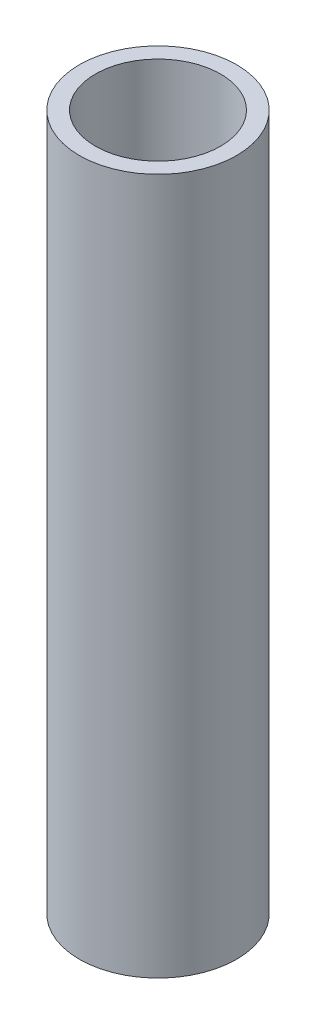
ISO-10303-21;
HEADER;
FILE_DESCRIPTION(('STEP AP214'),'2;1');
FILE_NAME('part.step','',(''),(''),'','','');
FILE_SCHEMA(('AUTOMOTIVE_DESIGN { 1 0 10303 214 1 1 1 1 }'));
ENDSEC;
DATA;
#1=APPLICATION_CONTEXT('core data for automotive mechanical design processes');
#2=APPLICATION_PROTOCOL_DEFINITION('international standard','automotive_design',2000,#1);
#3=PRODUCT_CONTEXT('',#1,'mechanical');
#4=PRODUCT('Part','Part','',(#3));
#5=PRODUCT_RELATED_PRODUCT_CATEGORY('part','',(#4));
#6=PRODUCT_DEFINITION_FORMATION('','',#4);
#7=PRODUCT_DEFINITION_CONTEXT('part definition',#1,'design');
#8=PRODUCT_DEFINITION('design','',#6,#7);
#9=PRODUCT_DEFINITION_SHAPE('','',#8);
#10=(LENGTH_UNIT() NAMED_UNIT(*) SI_UNIT(.MILLI.,.METRE.));
#11=(NAMED_UNIT(*) PLANE_ANGLE_UNIT() SI_UNIT($,.RADIAN.));
#12=(NAMED_UNIT(*) SI_UNIT($,.STERADIAN.) SOLID_ANGLE_UNIT());
#13=UNCERTAINTY_MEASURE_WITH_UNIT(LENGTH_MEASURE(1.E-05),#10,'distance_accuracy_value','');
#14=(GEOMETRIC_REPRESENTATION_CONTEXT(3) GLOBAL_UNCERTAINTY_ASSIGNED_CONTEXT((#13)) GLOBAL_UNIT_ASSIGNED_CONTEXT((#10,
#11,#12)) REPRESENTATION_CONTEXT('',''));
#15=CARTESIAN_POINT('',(0.,0.,0.));
#16=DIRECTION('',(0.,0.,1.));
#17=DIRECTION('',(1.,0.,0.));
#18=AXIS2_PLACEMENT_3D('',#15,#16,#17);
#19=CARTESIAN_POINT('',(0.,-104.521,0.));
#20=DIRECTION('',(0.,1.,0.));
#21=DIRECTION('',(0.,0.,1.));
#22=AXIS2_PLACEMENT_3D('',#19,#20,#21);
#23=CYLINDRICAL_SURFACE('',#22,11.811);
#24=CARTESIAN_POINT('',(0.,-104.521,0.));
#25=DIRECTION('',(0.,1.,0.));
#26=DIRECTION('',(0.,0.,1.));
#27=AXIS2_PLACEMENT_3D('',#24,#25,#26);
#28=CIRCLE('',#27,11.811);
#29=CARTESIAN_POINT('',(0.,-104.521,11.811));
#30=VERTEX_POINT('',#29);
#31=EDGE_CURVE('E11',#30,#30,#28,.T.);
#32=ORIENTED_EDGE('',*,*,#31,.T.);
#33=EDGE_LOOP('',(#32));
#34=FACE_BOUND('',#33,.T.);
#35=CARTESIAN_POINT('',(0.,0.,0.));
#36=DIRECTION('',(0.,1.,0.));
#37=DIRECTION('',(0.,0.,1.));
#38=AXIS2_PLACEMENT_3D('',#35,#36,#37);
#39=CIRCLE('',#38,11.811);
#40=CARTESIAN_POINT('',(0.,0.,11.811));
#41=VERTEX_POINT('',#40);
#42=EDGE_CURVE('E41',#41,#41,#39,.T.);
#43=ORIENTED_EDGE('',*,*,#42,.F.);
#44=EDGE_LOOP('',(#43));
#45=FACE_BOUND('',#44,.T.);
#46=ADVANCED_FACE('F34',(#34,#45),#23,.T.);
#47=CARTESIAN_POINT('',(0.,-104.521,0.));
#48=DIRECTION('',(0.,1.,0.));
#49=DIRECTION('',(0.,0.,1.));
#50=AXIS2_PLACEMENT_3D('',#47,#48,#49);
#51=PLANE('',#50);
#52=CARTESIAN_POINT('',(0.,-104.521,0.));
#53=DIRECTION('',(0.,1.,0.));
#54=DIRECTION('',(0.,0.,1.));
#55=AXIS2_PLACEMENT_3D('',#52,#53,#54);
#56=CIRCLE('',#55,6.096);
#57=CARTESIAN_POINT('',(0.,-104.521,6.096));
#58=VERTEX_POINT('',#57);
#59=EDGE_CURVE('E53',#58,#58,#56,.T.);
#60=ORIENTED_EDGE('',*,*,#59,.T.);
#61=EDGE_LOOP('',(#60));
#62=FACE_BOUND('',#61,.T.);
#63=ORIENTED_EDGE('',*,*,#31,.F.);
#64=EDGE_LOOP('',(#63));
#65=FACE_BOUND('',#64,.T.);
#66=ADVANCED_FACE('F78',(#62,#65),#51,.F.);
#67=CARTESIAN_POINT('',(0.,0.,0.));
#68=DIRECTION('',(0.,1.,0.));
#69=DIRECTION('',(0.,0.,1.));
#70=AXIS2_PLACEMENT_3D('',#67,#68,#69);
#71=PLANE('',#70);
#72=CARTESIAN_POINT('',(0.,0.,0.));
#73=DIRECTION('',(0.,1.,0.));
#74=DIRECTION('',(0.,0.,1.));
#75=AXIS2_PLACEMENT_3D('',#72,#73,#74);
#76=CIRCLE('',#75,9.398);
#77=CARTESIAN_POINT('',(0.,0.,9.398));
#78=VERTEX_POINT('',#77);
#79=EDGE_CURVE('E50',#78,#78,#76,.T.);
#80=ORIENTED_EDGE('',*,*,#79,.F.);
#81=EDGE_LOOP('',(#80));
#82=FACE_BOUND('',#81,.T.);
#83=ORIENTED_EDGE('',*,*,#42,.T.);
#84=EDGE_LOOP('',(#83));
#85=FACE_BOUND('',#84,.T.);
#86=ADVANCED_FACE('F72',(#82,#85),#71,.T.);
#87=CARTESIAN_POINT('',(0.,-131.102558118365,0.));
#88=DIRECTION('',(0.,1.,0.));
#89=DIRECTION('',(0.,0.,1.));
#90=AXIS2_PLACEMENT_3D('',#87,#88,#89);
#91=CYLINDRICAL_SURFACE('',#90,9.398);
#92=CARTESIAN_POINT('',(0.,-99.441,0.));
#93=DIRECTION('',(0.,1.,0.));
#94=DIRECTION('',(0.,0.,1.));
#95=AXIS2_PLACEMENT_3D('',#92,#93,#94);
#96=CIRCLE('',#95,9.398);
#97=CARTESIAN_POINT('',(0.,-99.441,9.398));
#98=VERTEX_POINT('',#97);
#99=EDGE_CURVE('E46',#98,#98,#96,.F.);
#100=ORIENTED_EDGE('',*,*,#99,.T.);
#101=EDGE_LOOP('',(#100));
#102=FACE_BOUND('',#101,.T.);
#103=ORIENTED_EDGE('',*,*,#79,.T.);
#104=EDGE_LOOP('',(#103));
#105=FACE_BOUND('',#104,.T.);
#106=ADVANCED_FACE('F66',(#102,#105),#91,.F.);
#107=CARTESIAN_POINT('',(0.,-99.441,0.));
#108=DIRECTION('',(0.,1.,0.));
#109=DIRECTION('',(0.,0.,1.));
#110=AXIS2_PLACEMENT_3D('',#107,#108,#109);
#111=PLANE('',#110);
#112=CARTESIAN_POINT('',(0.,-99.441,0.));
#113=DIRECTION('',(0.,1.,0.));
#114=DIRECTION('',(0.,0.,1.));
#115=AXIS2_PLACEMENT_3D('',#112,#113,#114);
#116=CIRCLE('',#115,6.096);
#117=CARTESIAN_POINT('',(0.,-99.441,6.096));
#118=VERTEX_POINT('',#117);
#119=EDGE_CURVE('E37',#118,#118,#116,.T.);
#120=ORIENTED_EDGE('',*,*,#119,.F.);
#121=EDGE_LOOP('',(#120));
#122=FACE_BOUND('',#121,.T.);
#123=ORIENTED_EDGE('',*,*,#99,.F.);
#124=EDGE_LOOP('',(#123));
#125=FACE_BOUND('',#124,.T.);
#126=ADVANCED_FACE('F63',(#122,#125),#111,.T.);
#127=CARTESIAN_POINT('',(0.,-104.521,0.));
#128=DIRECTION('',(0.,1.,0.));
#129=DIRECTION('',(0.,0.,1.));
#130=AXIS2_PLACEMENT_3D('',#127,#128,#129);
#131=CYLINDRICAL_SURFACE('',#130,6.096);
#132=ORIENTED_EDGE('',*,*,#119,.T.);
#133=EDGE_LOOP('',(#132));
#134=FACE_BOUND('',#133,.T.);
#135=ORIENTED_EDGE('',*,*,#59,.F.);
#136=EDGE_LOOP('',(#135));
#137=FACE_BOUND('',#136,.T.);
#138=ADVANCED_FACE('F60',(#134,#137),#131,.F.);
#139=CLOSED_SHELL('',(#46,#66,#86,#106,#126,#138));
#140=MANIFOLD_SOLID_BREP('B2',#139);
#141=ADVANCED_BREP_SHAPE_REPRESENTATION('',(#18,#140),#14);
#142=SHAPE_DEFINITION_REPRESENTATION(#9,#141);
ENDSEC;
END-ISO-10303-21;
